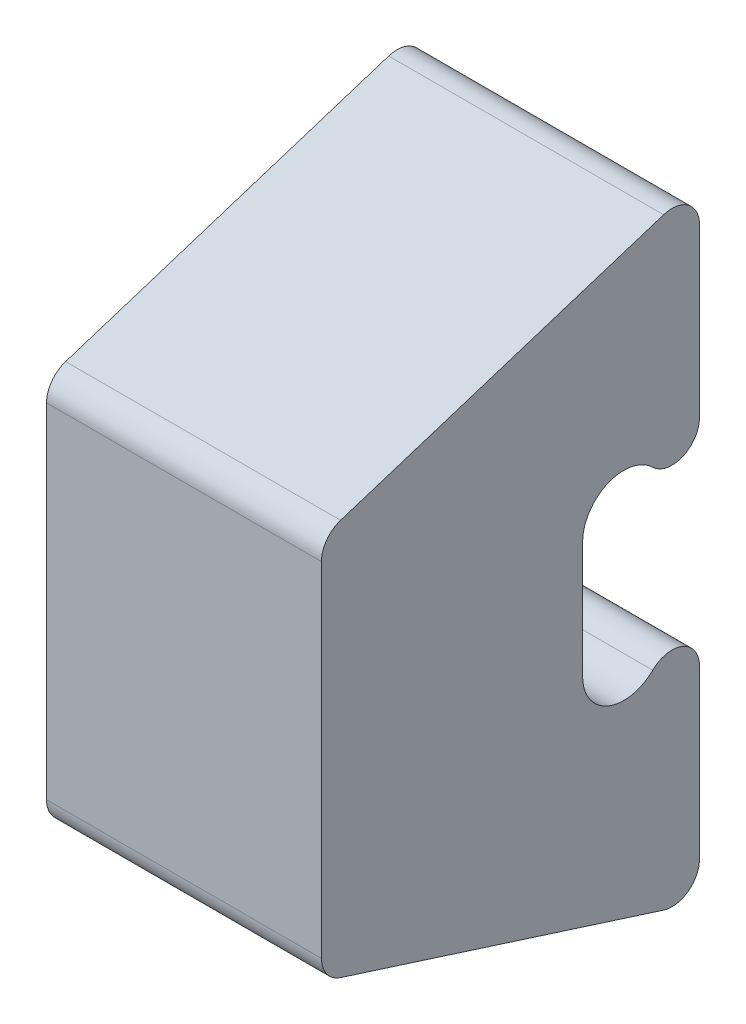
ISO-10303-21;
HEADER;
FILE_DESCRIPTION(('STEP AP214'),'2;1');
FILE_NAME('part.step','',(''),(''),'','','');
FILE_SCHEMA(('AUTOMOTIVE_DESIGN { 1 0 10303 214 1 1 1 1 }'));
ENDSEC;
DATA;
#1=APPLICATION_CONTEXT('core data for automotive mechanical design processes');
#2=APPLICATION_PROTOCOL_DEFINITION('international standard','automotive_design',2000,#1);
#3=PRODUCT_CONTEXT('',#1,'mechanical');
#4=PRODUCT('Part','Part','',(#3));
#5=PRODUCT_RELATED_PRODUCT_CATEGORY('part','',(#4));
#6=PRODUCT_DEFINITION_FORMATION('','',#4);
#7=PRODUCT_DEFINITION_CONTEXT('part definition',#1,'design');
#8=PRODUCT_DEFINITION('design','',#6,#7);
#9=PRODUCT_DEFINITION_SHAPE('','',#8);
#10=(LENGTH_UNIT() NAMED_UNIT(*) SI_UNIT(.MILLI.,.METRE.));
#11=(NAMED_UNIT(*) PLANE_ANGLE_UNIT() SI_UNIT($,.RADIAN.));
#12=(NAMED_UNIT(*) SI_UNIT($,.STERADIAN.) SOLID_ANGLE_UNIT());
#13=UNCERTAINTY_MEASURE_WITH_UNIT(LENGTH_MEASURE(1.E-05),#10,'distance_accuracy_value','');
#14=(GEOMETRIC_REPRESENTATION_CONTEXT(3) GLOBAL_UNCERTAINTY_ASSIGNED_CONTEXT((#13)) GLOBAL_UNIT_ASSIGNED_CONTEXT((#10,
#11,#12)) REPRESENTATION_CONTEXT('',''));
#15=CARTESIAN_POINT('',(0.,0.,0.));
#16=DIRECTION('',(0.,0.,1.));
#17=DIRECTION('',(1.,0.,0.));
#18=AXIS2_PLACEMENT_3D('',#15,#16,#17);
#19=CARTESIAN_POINT('',(-3.,-4.,5.80000000000001));
#20=DIRECTION('',(1.,0.,0.));
#21=DIRECTION('',(0.,0.,-1.));
#22=AXIS2_PLACEMENT_3D('',#19,#20,#21);
#23=CYLINDRICAL_SURFACE('',#22,0.4);
#24=DIRECTION('',(1.,0.,0.));
#25=VECTOR('',#24,1.);
#26=CARTESIAN_POINT('',(-3.,-4.,5.4));
#27=LINE('',#26,#25);
#28=CARTESIAN_POINT('',(-3.,-4.,5.4));
#29=VERTEX_POINT('',#28);
#30=CARTESIAN_POINT('',(1.,-4.,5.4));
#31=VERTEX_POINT('',#30);
#32=EDGE_CURVE('E42',#29,#31,#27,.T.);
#33=ORIENTED_EDGE('',*,*,#32,.T.);
#34=CARTESIAN_POINT('',(1.,-4.,5.80000000000001));
#35=DIRECTION('',(1.,0.,0.));
#36=DIRECTION('',(0.,0.,-1.));
#37=AXIS2_PLACEMENT_3D('',#34,#35,#36);
#38=CIRCLE('',#37,0.4);
#39=CARTESIAN_POINT('',(1.,-4.38106368448747,5.92161606951728));
#40=VERTEX_POINT('',#39);
#41=EDGE_CURVE('E141',#40,#31,#38,.T.);
#42=ORIENTED_EDGE('',*,*,#41,.F.);
#43=DIRECTION('',(1.,0.,0.));
#44=VECTOR('',#43,1.);
#45=CARTESIAN_POINT('',(-3.,-4.38106368448747,5.92161606951728));
#46=LINE('',#45,#44);
#47=CARTESIAN_POINT('',(-3.,-4.38106368448747,5.92161606951728));
#48=VERTEX_POINT('',#47);
#49=EDGE_CURVE('E11',#48,#40,#46,.T.);
#50=ORIENTED_EDGE('',*,*,#49,.F.);
#51=CARTESIAN_POINT('',(-3.,-4.,5.80000000000001));
#52=DIRECTION('',(1.,0.,0.));
#53=DIRECTION('',(0.,0.,-1.));
#54=AXIS2_PLACEMENT_3D('',#51,#52,#53);
#55=CIRCLE('',#54,0.4);
#56=EDGE_CURVE('E145',#48,#29,#55,.T.);
#57=ORIENTED_EDGE('',*,*,#56,.T.);
#58=EDGE_LOOP('',(#33,#42,#50,#57));
#59=FACE_BOUND('',#58,.T.);
#60=ADVANCED_FACE('F41',(#59),#23,.T.);
#61=CARTESIAN_POINT('',(-3.,-2.88106368448747,10.6216160695173));
#62=DIRECTION('',(0.,-0.952659211218683,0.304040173793197));
#63=DIRECTION('',(0.,-0.304040173793197,-0.952659211218683));
#64=AXIS2_PLACEMENT_3D('',#61,#62,#63);
#65=PLANE('',#64);
#66=ORIENTED_EDGE('',*,*,#49,.T.);
#67=DIRECTION('',(0.,-0.304040173793197,-0.952659211218683));
#68=VECTOR('',#67,1.);
#69=CARTESIAN_POINT('',(1.,-2.88106368448747,10.6216160695173));
#70=LINE('',#69,#68);
#71=CARTESIAN_POINT('',(1.,-2.88106368448747,10.6216160695173));
#72=VERTEX_POINT('',#71);
#73=EDGE_CURVE('E159',#72,#40,#70,.T.);
#74=ORIENTED_EDGE('',*,*,#73,.F.);
#75=DIRECTION('',(1.,0.,0.));
#76=VECTOR('',#75,1.);
#77=CARTESIAN_POINT('',(-3.,-2.88106368448747,10.6216160695173));
#78=LINE('',#77,#76);
#79=CARTESIAN_POINT('',(-3.,-2.88106368448747,10.6216160695173));
#80=VERTEX_POINT('',#79);
#81=EDGE_CURVE('E47',#80,#72,#78,.T.);
#82=ORIENTED_EDGE('',*,*,#81,.F.);
#83=DIRECTION('',(0.,-0.304040173793197,-0.952659211218683));
#84=VECTOR('',#83,1.);
#85=CARTESIAN_POINT('',(-3.,-2.88106368448747,10.6216160695173));
#86=LINE('',#85,#84);
#87=EDGE_CURVE('E150',#80,#48,#86,.T.);
#88=ORIENTED_EDGE('',*,*,#87,.T.);
#89=EDGE_LOOP('',(#66,#74,#82,#88));
#90=FACE_BOUND('',#89,.T.);
#91=ADVANCED_FACE('F293',(#90),#65,.T.);
#92=CARTESIAN_POINT('',(-3.,-2.5,10.5));
#93=DIRECTION('',(1.,0.,0.));
#94=DIRECTION('',(0.,0.,-1.));
#95=AXIS2_PLACEMENT_3D('',#92,#93,#94);
#96=CYLINDRICAL_SURFACE('',#95,0.400000000000001);
#97=ORIENTED_EDGE('',*,*,#81,.T.);
#98=CARTESIAN_POINT('',(1.,-2.5,10.5));
#99=DIRECTION('',(1.,0.,0.));
#100=DIRECTION('',(0.,0.,-1.));
#101=AXIS2_PLACEMENT_3D('',#98,#99,#100);
#102=CIRCLE('',#101,0.400000000000001);
#103=CARTESIAN_POINT('',(1.,-2.5,10.9));
#104=VERTEX_POINT('',#103);
#105=EDGE_CURVE('E189',#104,#72,#102,.T.);
#106=ORIENTED_EDGE('',*,*,#105,.F.);
#107=DIRECTION('',(1.,0.,0.));
#108=VECTOR('',#107,1.);
#109=CARTESIAN_POINT('',(-3.,-2.5,10.9));
#110=LINE('',#109,#108);
#111=CARTESIAN_POINT('',(-3.,-2.5,10.9));
#112=VERTEX_POINT('',#111);
#113=EDGE_CURVE('E229',#112,#104,#110,.T.);
#114=ORIENTED_EDGE('',*,*,#113,.F.);
#115=CARTESIAN_POINT('',(-3.,-2.5,10.5));
#116=DIRECTION('',(1.,0.,0.));
#117=DIRECTION('',(0.,0.,-1.));
#118=AXIS2_PLACEMENT_3D('',#115,#116,#117);
#119=CIRCLE('',#118,0.400000000000001);
#120=EDGE_CURVE('E226',#112,#80,#119,.T.);
#121=ORIENTED_EDGE('',*,*,#120,.T.);
#122=EDGE_LOOP('',(#97,#106,#114,#121));
#123=FACE_BOUND('',#122,.T.);
#124=ADVANCED_FACE('F294',(#123),#96,.T.);
#125=CARTESIAN_POINT('',(-3.,2.5,10.9));
#126=DIRECTION('',(0.,0.,1.));
#127=DIRECTION('',(1.,0.,0.));
#128=AXIS2_PLACEMENT_3D('',#125,#126,#127);
#129=PLANE('',#128);
#130=ORIENTED_EDGE('',*,*,#113,.T.);
#131=DIRECTION('',(0.,-1.,0.));
#132=VECTOR('',#131,1.);
#133=CARTESIAN_POINT('',(1.,2.5,10.9));
#134=LINE('',#133,#132);
#135=CARTESIAN_POINT('',(1.,2.5,10.9));
#136=VERTEX_POINT('',#135);
#137=EDGE_CURVE('E190',#136,#104,#134,.T.);
#138=ORIENTED_EDGE('',*,*,#137,.F.);
#139=DIRECTION('',(1.,0.,0.));
#140=VECTOR('',#139,1.);
#141=CARTESIAN_POINT('',(-3.,2.5,10.9));
#142=LINE('',#141,#140);
#143=CARTESIAN_POINT('',(-3.,2.5,10.9));
#144=VERTEX_POINT('',#143);
#145=EDGE_CURVE('E235',#144,#136,#142,.T.);
#146=ORIENTED_EDGE('',*,*,#145,.F.);
#147=DIRECTION('',(0.,-1.,0.));
#148=VECTOR('',#147,1.);
#149=CARTESIAN_POINT('',(-3.,2.5,10.9));
#150=LINE('',#149,#148);
#151=EDGE_CURVE('E223',#144,#112,#150,.T.);
#152=ORIENTED_EDGE('',*,*,#151,.T.);
#153=EDGE_LOOP('',(#130,#138,#146,#152));
#154=FACE_BOUND('',#153,.T.);
#155=ADVANCED_FACE('F288',(#154),#129,.T.);
#156=CARTESIAN_POINT('',(-3.,2.5,10.5));
#157=DIRECTION('',(1.,0.,0.));
#158=DIRECTION('',(0.,0.,-1.));
#159=AXIS2_PLACEMENT_3D('',#156,#157,#158);
#160=CYLINDRICAL_SURFACE('',#159,0.4);
#161=ORIENTED_EDGE('',*,*,#145,.T.);
#162=CARTESIAN_POINT('',(1.,2.5,10.5));
#163=DIRECTION('',(1.,0.,0.));
#164=DIRECTION('',(0.,0.,-1.));
#165=AXIS2_PLACEMENT_3D('',#162,#163,#164);
#166=CIRCLE('',#165,0.4);
#167=CARTESIAN_POINT('',(1.,2.88106368448747,10.6216160695173));
#168=VERTEX_POINT('',#167);
#169=EDGE_CURVE('E182',#168,#136,#166,.T.);
#170=ORIENTED_EDGE('',*,*,#169,.F.);
#171=DIRECTION('',(1.,0.,0.));
#172=VECTOR('',#171,1.);
#173=CARTESIAN_POINT('',(-3.,2.88106368448747,10.6216160695173));
#174=LINE('',#173,#172);
#175=CARTESIAN_POINT('',(-3.,2.88106368448747,10.6216160695173));
#176=VERTEX_POINT('',#175);
#177=EDGE_CURVE('E233',#176,#168,#174,.T.);
#178=ORIENTED_EDGE('',*,*,#177,.F.);
#179=CARTESIAN_POINT('',(-3.,2.5,10.5));
#180=DIRECTION('',(1.,0.,0.));
#181=DIRECTION('',(0.,0.,-1.));
#182=AXIS2_PLACEMENT_3D('',#179,#180,#181);
#183=CIRCLE('',#182,0.4);
#184=EDGE_CURVE('E217',#176,#144,#183,.T.);
#185=ORIENTED_EDGE('',*,*,#184,.T.);
#186=EDGE_LOOP('',(#161,#170,#178,#185));
#187=FACE_BOUND('',#186,.T.);
#188=ADVANCED_FACE('F283',(#187),#160,.T.);
#189=CARTESIAN_POINT('',(-3.,4.38106368448747,5.92161606951728));
#190=DIRECTION('',(0.,0.952659211218683,0.304040173793196));
#191=DIRECTION('',(0.,-0.304040173793196,0.952659211218683));
#192=AXIS2_PLACEMENT_3D('',#189,#190,#191);
#193=PLANE('',#192);
#194=ORIENTED_EDGE('',*,*,#177,.T.);
#195=DIRECTION('',(0.,-0.304040173793196,0.952659211218683));
#196=VECTOR('',#195,1.);
#197=CARTESIAN_POINT('',(1.,4.38106368448747,5.92161606951728));
#198=LINE('',#197,#196);
#199=CARTESIAN_POINT('',(1.,4.38106368448747,5.92161606951728));
#200=VERTEX_POINT('',#199);
#201=EDGE_CURVE('E181',#200,#168,#198,.T.);
#202=ORIENTED_EDGE('',*,*,#201,.F.);
#203=DIRECTION('',(1.,0.,0.));
#204=VECTOR('',#203,1.);
#205=CARTESIAN_POINT('',(-3.,4.38106368448747,5.92161606951728));
#206=LINE('',#205,#204);
#207=CARTESIAN_POINT('',(-3.,4.38106368448747,5.92161606951728));
#208=VERTEX_POINT('',#207);
#209=EDGE_CURVE('E237',#208,#200,#206,.T.);
#210=ORIENTED_EDGE('',*,*,#209,.F.);
#211=DIRECTION('',(0.,-0.304040173793196,0.952659211218683));
#212=VECTOR('',#211,1.);
#213=CARTESIAN_POINT('',(-3.,4.38106368448747,5.92161606951728));
#214=LINE('',#213,#212);
#215=EDGE_CURVE('E220',#208,#176,#214,.T.);
#216=ORIENTED_EDGE('',*,*,#215,.T.);
#217=EDGE_LOOP('',(#194,#202,#210,#216));
#218=FACE_BOUND('',#217,.T.);
#219=ADVANCED_FACE('F284',(#218),#193,.T.);
#220=CARTESIAN_POINT('',(-3.,4.,5.80000000000001));
#221=DIRECTION('',(1.,0.,0.));
#222=DIRECTION('',(0.,0.,-1.));
#223=AXIS2_PLACEMENT_3D('',#220,#221,#222);
#224=CYLINDRICAL_SURFACE('',#223,0.399999999999999);
#225=ORIENTED_EDGE('',*,*,#209,.T.);
#226=CARTESIAN_POINT('',(1.,4.,5.80000000000001));
#227=DIRECTION('',(1.,0.,0.));
#228=DIRECTION('',(0.,0.,-1.));
#229=AXIS2_PLACEMENT_3D('',#226,#227,#228);
#230=CIRCLE('',#229,0.399999999999999);
#231=CARTESIAN_POINT('',(1.,4.,5.40000000000001));
#232=VERTEX_POINT('',#231);
#233=EDGE_CURVE('E178',#232,#200,#230,.T.);
#234=ORIENTED_EDGE('',*,*,#233,.F.);
#235=DIRECTION('',(1.,0.,0.));
#236=VECTOR('',#235,1.);
#237=CARTESIAN_POINT('',(-3.,4.,5.40000000000001));
#238=LINE('',#237,#236);
#239=CARTESIAN_POINT('',(-3.,4.,5.40000000000001));
#240=VERTEX_POINT('',#239);
#241=EDGE_CURVE('E239',#240,#232,#238,.T.);
#242=ORIENTED_EDGE('',*,*,#241,.F.);
#243=CARTESIAN_POINT('',(-3.,4.,5.80000000000001));
#244=DIRECTION('',(1.,0.,0.));
#245=DIRECTION('',(0.,0.,-1.));
#246=AXIS2_PLACEMENT_3D('',#243,#244,#245);
#247=CIRCLE('',#246,0.399999999999999);
#248=EDGE_CURVE('E215',#240,#208,#247,.T.);
#249=ORIENTED_EDGE('',*,*,#248,.T.);
#250=EDGE_LOOP('',(#225,#234,#242,#249));
#251=FACE_BOUND('',#250,.T.);
#252=ADVANCED_FACE('F277',(#251),#224,.T.);
#253=CARTESIAN_POINT('',(-3.,1.56416824975862,5.4));
#254=DIRECTION('',(0.,0.,-1.));
#255=DIRECTION('',(0.,1.,0.));
#256=AXIS2_PLACEMENT_3D('',#253,#254,#255);
#257=PLANE('',#256);
#258=ORIENTED_EDGE('',*,*,#241,.T.);
#259=DIRECTION('',(0.,1.,0.));
#260=VECTOR('',#259,1.);
#261=CARTESIAN_POINT('',(1.,1.56416824975862,5.4));
#262=LINE('',#261,#260);
#263=CARTESIAN_POINT('',(1.,1.56416824975862,5.4));
#264=VERTEX_POINT('',#263);
#265=EDGE_CURVE('E172',#264,#232,#262,.T.);
#266=ORIENTED_EDGE('',*,*,#265,.F.);
#267=DIRECTION('',(1.,0.,0.));
#268=VECTOR('',#267,1.);
#269=CARTESIAN_POINT('',(-3.,1.56416824975862,5.4));
#270=LINE('',#269,#268);
#271=CARTESIAN_POINT('',(-3.,1.56416824975862,5.4));
#272=VERTEX_POINT('',#271);
#273=EDGE_CURVE('E238',#272,#264,#270,.T.);
#274=ORIENTED_EDGE('',*,*,#273,.F.);
#275=DIRECTION('',(0.,1.,0.));
#276=VECTOR('',#275,1.);
#277=CARTESIAN_POINT('',(-3.,1.56416824975862,5.4));
#278=LINE('',#277,#276);
#279=EDGE_CURVE('E213',#272,#240,#278,.T.);
#280=ORIENTED_EDGE('',*,*,#279,.T.);
#281=EDGE_LOOP('',(#258,#266,#274,#280));
#282=FACE_BOUND('',#281,.T.);
#283=ADVANCED_FACE('F273',(#282),#257,.T.);
#284=CARTESIAN_POINT('',(-3.,1.56416824975862,5.8));
#285=DIRECTION('',(1.,0.,0.));
#286=DIRECTION('',(0.,0.,-1.));
#287=AXIS2_PLACEMENT_3D('',#284,#285,#286);
#288=CYLINDRICAL_SURFACE('',#287,0.4);
#289=ORIENTED_EDGE('',*,*,#273,.T.);
#290=CARTESIAN_POINT('',(1.,1.56416824975862,5.8));
#291=DIRECTION('',(1.,0.,0.));
#292=DIRECTION('',(0.,0.,-1.));
#293=AXIS2_PLACEMENT_3D('',#290,#291,#292);
#294=CIRCLE('',#293,0.4);
#295=CARTESIAN_POINT('',(1.,1.27851111261691,6.08));
#296=VERTEX_POINT('',#295);
#297=EDGE_CURVE('E175',#296,#264,#294,.T.);
#298=ORIENTED_EDGE('',*,*,#297,.F.);
#299=DIRECTION('',(1.,0.,0.));
#300=VECTOR('',#299,1.);
#301=CARTESIAN_POINT('',(-3.,1.27851111261691,6.08));
#302=LINE('',#301,#300);
#303=CARTESIAN_POINT('',(-3.,1.27851111261691,6.08));
#304=VERTEX_POINT('',#303);
#305=EDGE_CURVE('E244',#304,#296,#302,.T.);
#306=ORIENTED_EDGE('',*,*,#305,.F.);
#307=CARTESIAN_POINT('',(-3.,1.56416824975862,5.8));
#308=DIRECTION('',(1.,0.,0.));
#309=DIRECTION('',(0.,0.,-1.));
#310=AXIS2_PLACEMENT_3D('',#307,#308,#309);
#311=CIRCLE('',#310,0.4);
#312=EDGE_CURVE('E210',#304,#272,#311,.T.);
#313=ORIENTED_EDGE('',*,*,#312,.T.);
#314=EDGE_LOOP('',(#289,#298,#306,#313));
#315=FACE_BOUND('',#314,.T.);
#316=ADVANCED_FACE('F271',(#315),#288,.T.);
#317=CARTESIAN_POINT('',(-3.,0.850025406904339,6.5));
#318=DIRECTION('',(1.,0.,0.));
#319=DIRECTION('',(0.,0.,-1.));
#320=AXIS2_PLACEMENT_3D('',#317,#318,#319);
#321=CYLINDRICAL_SURFACE('',#320,0.600000000000001);
#322=ORIENTED_EDGE('',*,*,#305,.T.);
#323=CARTESIAN_POINT('',(1.,0.850025406904339,6.5));
#324=DIRECTION('',(-1.,0.,0.));
#325=DIRECTION('',(0.,0.,-1.));
#326=AXIS2_PLACEMENT_3D('',#323,#324,#325);
#327=CIRCLE('',#326,0.600000000000001);
#328=CARTESIAN_POINT('',(1.,0.850025406904339,7.1));
#329=VERTEX_POINT('',#328);
#330=EDGE_CURVE('E170',#329,#296,#327,.T.);
#331=ORIENTED_EDGE('',*,*,#330,.F.);
#332=DIRECTION('',(1.,0.,0.));
#333=VECTOR('',#332,1.);
#334=CARTESIAN_POINT('',(-3.,0.850025406904339,7.1));
#335=LINE('',#334,#333);
#336=CARTESIAN_POINT('',(-3.,0.850025406904339,7.1));
#337=VERTEX_POINT('',#336);
#338=EDGE_CURVE('E241',#337,#329,#335,.T.);
#339=ORIENTED_EDGE('',*,*,#338,.F.);
#340=CARTESIAN_POINT('',(-3.,0.850025406904339,6.5));
#341=DIRECTION('',(-1.,0.,0.));
#342=DIRECTION('',(0.,0.,-1.));
#343=AXIS2_PLACEMENT_3D('',#340,#341,#342);
#344=CIRCLE('',#343,0.600000000000001);
#345=EDGE_CURVE('E203',#337,#304,#344,.T.);
#346=ORIENTED_EDGE('',*,*,#345,.T.);
#347=EDGE_LOOP('',(#322,#331,#339,#346));
#348=FACE_BOUND('',#347,.T.);
#349=ADVANCED_FACE('F266',(#348),#321,.F.);
#350=CARTESIAN_POINT('',(-3.,-0.85002540690434,7.1));
#351=DIRECTION('',(0.,0.,-1.));
#352=DIRECTION('',(0.,1.,0.));
#353=AXIS2_PLACEMENT_3D('',#350,#351,#352);
#354=PLANE('',#353);
#355=ORIENTED_EDGE('',*,*,#338,.T.);
#356=DIRECTION('',(0.,1.,0.));
#357=VECTOR('',#356,1.);
#358=CARTESIAN_POINT('',(1.,-0.85002540690434,7.1));
#359=LINE('',#358,#357);
#360=CARTESIAN_POINT('',(1.,-0.85002540690434,7.1));
#361=VERTEX_POINT('',#360);
#362=EDGE_CURVE('E168',#361,#329,#359,.T.);
#363=ORIENTED_EDGE('',*,*,#362,.F.);
#364=DIRECTION('',(1.,0.,0.));
#365=VECTOR('',#364,1.);
#366=CARTESIAN_POINT('',(-3.,-0.85002540690434,7.1));
#367=LINE('',#366,#365);
#368=CARTESIAN_POINT('',(-3.,-0.85002540690434,7.1));
#369=VERTEX_POINT('',#368);
#370=EDGE_CURVE('E247',#369,#361,#367,.T.);
#371=ORIENTED_EDGE('',*,*,#370,.F.);
#372=DIRECTION('',(0.,1.,0.));
#373=VECTOR('',#372,1.);
#374=CARTESIAN_POINT('',(-3.,-0.85002540690434,7.1));
#375=LINE('',#374,#373);
#376=EDGE_CURVE('E205',#369,#337,#375,.T.);
#377=ORIENTED_EDGE('',*,*,#376,.T.);
#378=EDGE_LOOP('',(#355,#363,#371,#377));
#379=FACE_BOUND('',#378,.T.);
#380=ADVANCED_FACE('F260',(#379),#354,.T.);
#381=CARTESIAN_POINT('',(-3.,-0.850025406904339,6.5));
#382=DIRECTION('',(1.,0.,0.));
#383=DIRECTION('',(0.,0.,-1.));
#384=AXIS2_PLACEMENT_3D('',#381,#382,#383);
#385=CYLINDRICAL_SURFACE('',#384,0.6);
#386=ORIENTED_EDGE('',*,*,#370,.T.);
#387=CARTESIAN_POINT('',(1.,-0.850025406904339,6.5));
#388=DIRECTION('',(-1.,0.,0.));
#389=DIRECTION('',(0.,0.,-1.));
#390=AXIS2_PLACEMENT_3D('',#387,#388,#389);
#391=CIRCLE('',#390,0.6);
#392=CARTESIAN_POINT('',(1.,-1.27851111261691,6.08));
#393=VERTEX_POINT('',#392);
#394=EDGE_CURVE('E165',#393,#361,#391,.T.);
#395=ORIENTED_EDGE('',*,*,#394,.F.);
#396=DIRECTION('',(1.,0.,0.));
#397=VECTOR('',#396,1.);
#398=CARTESIAN_POINT('',(-3.,-1.27851111261691,6.08));
#399=LINE('',#398,#397);
#400=CARTESIAN_POINT('',(-3.,-1.27851111261691,6.08));
#401=VERTEX_POINT('',#400);
#402=EDGE_CURVE('E246',#401,#393,#399,.T.);
#403=ORIENTED_EDGE('',*,*,#402,.F.);
#404=CARTESIAN_POINT('',(-3.,-0.850025406904339,6.5));
#405=DIRECTION('',(-1.,0.,0.));
#406=DIRECTION('',(0.,0.,-1.));
#407=AXIS2_PLACEMENT_3D('',#404,#405,#406);
#408=CIRCLE('',#407,0.6);
#409=EDGE_CURVE('E196',#401,#369,#408,.T.);
#410=ORIENTED_EDGE('',*,*,#409,.T.);
#411=EDGE_LOOP('',(#386,#395,#403,#410));
#412=FACE_BOUND('',#411,.T.);
#413=ADVANCED_FACE('F258',(#412),#385,.F.);
#414=CARTESIAN_POINT('',(-3.,-1.56416824975862,5.80000000000001));
#415=DIRECTION('',(1.,0.,0.));
#416=DIRECTION('',(0.,0.,-1.));
#417=AXIS2_PLACEMENT_3D('',#414,#415,#416);
#418=CYLINDRICAL_SURFACE('',#417,0.4);
#419=ORIENTED_EDGE('',*,*,#402,.T.);
#420=CARTESIAN_POINT('',(1.,-1.56416824975862,5.80000000000001));
#421=DIRECTION('',(1.,0.,0.));
#422=DIRECTION('',(0.,0.,-1.));
#423=AXIS2_PLACEMENT_3D('',#420,#421,#422);
#424=CIRCLE('',#423,0.4);
#425=CARTESIAN_POINT('',(1.,-1.56416824975862,5.4));
#426=VERTEX_POINT('',#425);
#427=EDGE_CURVE('E151',#426,#393,#424,.T.);
#428=ORIENTED_EDGE('',*,*,#427,.F.);
#429=DIRECTION('',(1.,0.,0.));
#430=VECTOR('',#429,1.);
#431=CARTESIAN_POINT('',(-3.,-1.56416824975862,5.4));
#432=LINE('',#431,#430);
#433=CARTESIAN_POINT('',(-3.,-1.56416824975862,5.4));
#434=VERTEX_POINT('',#433);
#435=EDGE_CURVE('E147',#434,#426,#432,.T.);
#436=ORIENTED_EDGE('',*,*,#435,.F.);
#437=CARTESIAN_POINT('',(-3.,-1.56416824975862,5.80000000000001));
#438=DIRECTION('',(1.,0.,0.));
#439=DIRECTION('',(0.,0.,-1.));
#440=AXIS2_PLACEMENT_3D('',#437,#438,#439);
#441=CIRCLE('',#440,0.4);
#442=EDGE_CURVE('E197',#434,#401,#441,.T.);
#443=ORIENTED_EDGE('',*,*,#442,.T.);
#444=EDGE_LOOP('',(#419,#428,#436,#443));
#445=FACE_BOUND('',#444,.T.);
#446=ADVANCED_FACE('F248',(#445),#418,.T.);
#447=CARTESIAN_POINT('',(-3.,-4.,5.4));
#448=DIRECTION('',(0.,0.,-1.));
#449=DIRECTION('',(-1.,0.,0.));
#450=AXIS2_PLACEMENT_3D('',#447,#448,#449);
#451=PLANE('',#450);
#452=ORIENTED_EDGE('',*,*,#435,.T.);
#453=DIRECTION('',(0.,1.,0.));
#454=VECTOR('',#453,1.);
#455=CARTESIAN_POINT('',(1.,-4.,5.4));
#456=LINE('',#455,#454);
#457=EDGE_CURVE('E146',#31,#426,#456,.T.);
#458=ORIENTED_EDGE('',*,*,#457,.F.);
#459=ORIENTED_EDGE('',*,*,#32,.F.);
#460=DIRECTION('',(0.,1.,0.));
#461=VECTOR('',#460,1.);
#462=CARTESIAN_POINT('',(-3.,-4.,5.4));
#463=LINE('',#462,#461);
#464=EDGE_CURVE('E191',#29,#434,#463,.T.);
#465=ORIENTED_EDGE('',*,*,#464,.T.);
#466=EDGE_LOOP('',(#452,#458,#459,#465));
#467=FACE_BOUND('',#466,.T.);
#468=ADVANCED_FACE('F148',(#467),#451,.T.);
#469=CARTESIAN_POINT('',(-3.,-4.,5.80000000000001));
#470=DIRECTION('',(1.,0.,0.));
#471=DIRECTION('',(0.,0.,-1.));
#472=AXIS2_PLACEMENT_3D('',#469,#470,#471);
#473=PLANE('',#472);
#474=ORIENTED_EDGE('',*,*,#56,.F.);
#475=ORIENTED_EDGE('',*,*,#87,.F.);
#476=ORIENTED_EDGE('',*,*,#120,.F.);
#477=ORIENTED_EDGE('',*,*,#151,.F.);
#478=ORIENTED_EDGE('',*,*,#184,.F.);
#479=ORIENTED_EDGE('',*,*,#215,.F.);
#480=ORIENTED_EDGE('',*,*,#248,.F.);
#481=ORIENTED_EDGE('',*,*,#279,.F.);
#482=ORIENTED_EDGE('',*,*,#312,.F.);
#483=ORIENTED_EDGE('',*,*,#345,.F.);
#484=ORIENTED_EDGE('',*,*,#376,.F.);
#485=ORIENTED_EDGE('',*,*,#409,.F.);
#486=ORIENTED_EDGE('',*,*,#442,.F.);
#487=ORIENTED_EDGE('',*,*,#464,.F.);
#488=EDGE_LOOP('',(#474,#475,#476,#477,#478,#479,#480,#481,#482,#483,#484,#485,#486,#487));
#489=FACE_BOUND('',#488,.T.);
#490=ADVANCED_FACE('F265',(#489),#473,.F.);
#491=CARTESIAN_POINT('',(1.,-4.,5.80000000000001));
#492=DIRECTION('',(1.,0.,0.));
#493=DIRECTION('',(0.,0.,-1.));
#494=AXIS2_PLACEMENT_3D('',#491,#492,#493);
#495=PLANE('',#494);
#496=ORIENTED_EDGE('',*,*,#41,.T.);
#497=ORIENTED_EDGE('',*,*,#457,.T.);
#498=ORIENTED_EDGE('',*,*,#427,.T.);
#499=ORIENTED_EDGE('',*,*,#394,.T.);
#500=ORIENTED_EDGE('',*,*,#362,.T.);
#501=ORIENTED_EDGE('',*,*,#330,.T.);
#502=ORIENTED_EDGE('',*,*,#297,.T.);
#503=ORIENTED_EDGE('',*,*,#265,.T.);
#504=ORIENTED_EDGE('',*,*,#233,.T.);
#505=ORIENTED_EDGE('',*,*,#201,.T.);
#506=ORIENTED_EDGE('',*,*,#169,.T.);
#507=ORIENTED_EDGE('',*,*,#137,.T.);
#508=ORIENTED_EDGE('',*,*,#105,.T.);
#509=ORIENTED_EDGE('',*,*,#73,.T.);
#510=EDGE_LOOP('',(#496,#497,#498,#499,#500,#501,#502,#503,#504,#505,#506,#507,#508,#509));
#511=FACE_BOUND('',#510,.T.);
#512=ADVANCED_FACE('F160',(#511),#495,.T.);
#513=CLOSED_SHELL('',(#60,#91,#124,#155,#188,#219,#252,#283,#316,#349,#380,#413,#446,#468,#490,#512));
#514=MANIFOLD_SOLID_BREP('B2',#513);
#515=ADVANCED_BREP_SHAPE_REPRESENTATION('',(#18,#514),#14);
#516=SHAPE_DEFINITION_REPRESENTATION(#9,#515);
ENDSEC;
END-ISO-10303-21;
